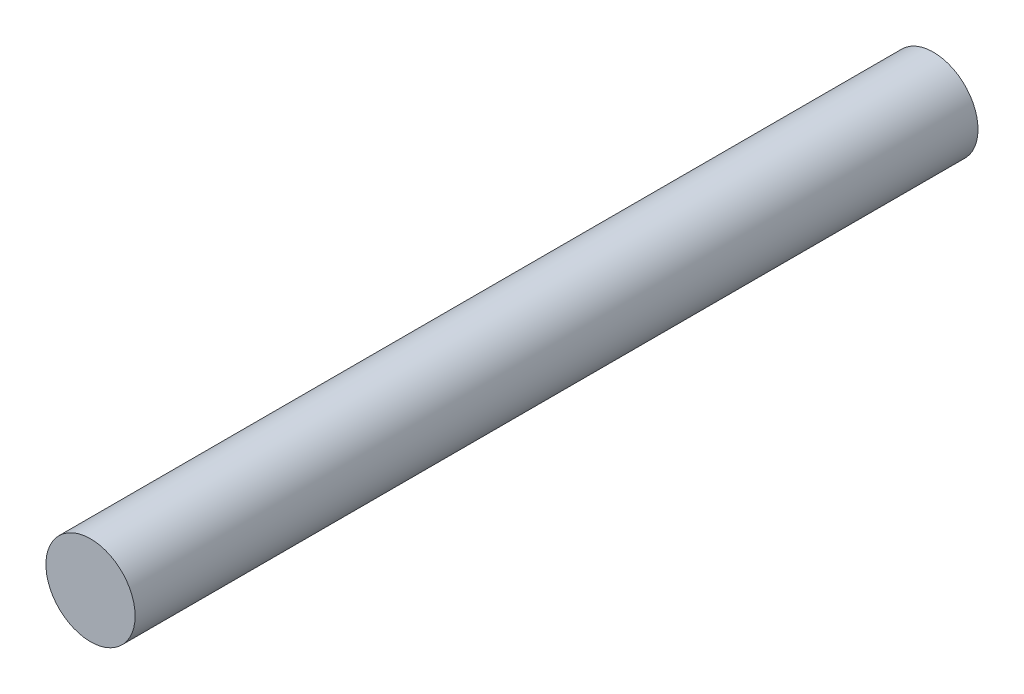
ISO-10303-21;
HEADER;
FILE_DESCRIPTION(('STEP AP214'),'2;1');
FILE_NAME('part.step','',(''),(''),'','','');
FILE_SCHEMA(('AUTOMOTIVE_DESIGN { 1 0 10303 214 1 1 1 1 }'));
ENDSEC;
DATA;
#1=APPLICATION_CONTEXT('core data for automotive mechanical design processes');
#2=APPLICATION_PROTOCOL_DEFINITION('international standard','automotive_design',2000,#1);
#3=PRODUCT_CONTEXT('',#1,'mechanical');
#4=PRODUCT('Part','Part','',(#3));
#5=PRODUCT_RELATED_PRODUCT_CATEGORY('part','',(#4));
#6=PRODUCT_DEFINITION_FORMATION('','',#4);
#7=PRODUCT_DEFINITION_CONTEXT('part definition',#1,'design');
#8=PRODUCT_DEFINITION('design','',#6,#7);
#9=PRODUCT_DEFINITION_SHAPE('','',#8);
#10=(LENGTH_UNIT() NAMED_UNIT(*) SI_UNIT(.MILLI.,.METRE.));
#11=(NAMED_UNIT(*) PLANE_ANGLE_UNIT() SI_UNIT($,.RADIAN.));
#12=(NAMED_UNIT(*) SI_UNIT($,.STERADIAN.) SOLID_ANGLE_UNIT());
#13=UNCERTAINTY_MEASURE_WITH_UNIT(LENGTH_MEASURE(1.E-05),#10,'distance_accuracy_value','');
#14=(GEOMETRIC_REPRESENTATION_CONTEXT(3) GLOBAL_UNCERTAINTY_ASSIGNED_CONTEXT((#13)) GLOBAL_UNIT_ASSIGNED_CONTEXT((#10,
#11,#12)) REPRESENTATION_CONTEXT('',''));
#15=CARTESIAN_POINT('',(0.,0.,0.));
#16=DIRECTION('',(0.,0.,1.));
#17=DIRECTION('',(1.,0.,0.));
#18=AXIS2_PLACEMENT_3D('',#15,#16,#17);
#19=CARTESIAN_POINT('',(0.,0.,75.));
#20=DIRECTION('',(0.,0.,-1.));
#21=DIRECTION('',(-1.,0.,0.));
#22=AXIS2_PLACEMENT_3D('',#19,#20,#21);
#23=CYLINDRICAL_SURFACE('',#22,7.9375);
#24=CARTESIAN_POINT('',(0.,0.,75.));
#25=DIRECTION('',(0.,0.,1.));
#26=DIRECTION('',(1.,0.,0.));
#27=AXIS2_PLACEMENT_3D('',#24,#25,#26);
#28=CIRCLE('',#27,7.9375);
#29=CARTESIAN_POINT('',(7.9375,0.,75.));
#30=VERTEX_POINT('',#29);
#31=EDGE_CURVE('E10',#30,#30,#28,.T.);
#32=ORIENTED_EDGE('',*,*,#31,.F.);
#33=EDGE_LOOP('',(#32));
#34=FACE_BOUND('',#33,.T.);
#35=CARTESIAN_POINT('',(0.,0.,-75.));
#36=DIRECTION('',(0.,0.,1.));
#37=DIRECTION('',(1.,0.,0.));
#38=AXIS2_PLACEMENT_3D('',#35,#36,#37);
#39=CIRCLE('',#38,7.9375);
#40=CARTESIAN_POINT('',(7.9375,0.,-75.));
#41=VERTEX_POINT('',#40);
#42=EDGE_CURVE('E34',#41,#41,#39,.T.);
#43=ORIENTED_EDGE('',*,*,#42,.T.);
#44=EDGE_LOOP('',(#43));
#45=FACE_BOUND('',#44,.T.);
#46=ADVANCED_FACE('F31',(#34,#45),#23,.T.);
#47=CARTESIAN_POINT('',(0.,0.,75.));
#48=DIRECTION('',(0.,0.,1.));
#49=DIRECTION('',(1.,0.,0.));
#50=AXIS2_PLACEMENT_3D('',#47,#48,#49);
#51=PLANE('',#50);
#52=ORIENTED_EDGE('',*,*,#31,.T.);
#53=EDGE_LOOP('',(#52));
#54=FACE_BOUND('',#53,.T.);
#55=ADVANCED_FACE('F46',(#54),#51,.T.);
#56=CARTESIAN_POINT('',(0.,0.,-75.));
#57=DIRECTION('',(0.,0.,1.));
#58=DIRECTION('',(1.,0.,0.));
#59=AXIS2_PLACEMENT_3D('',#56,#57,#58);
#60=PLANE('',#59);
#61=ORIENTED_EDGE('',*,*,#42,.F.);
#62=EDGE_LOOP('',(#61));
#63=FACE_BOUND('',#62,.T.);
#64=ADVANCED_FACE('F44',(#63),#60,.F.);
#65=CLOSED_SHELL('',(#46,#55,#64));
#66=MANIFOLD_SOLID_BREP('B2',#65);
#67=ADVANCED_BREP_SHAPE_REPRESENTATION('',(#18,#66),#14);
#68=SHAPE_DEFINITION_REPRESENTATION(#9,#67);
ENDSEC;
END-ISO-10303-21;
